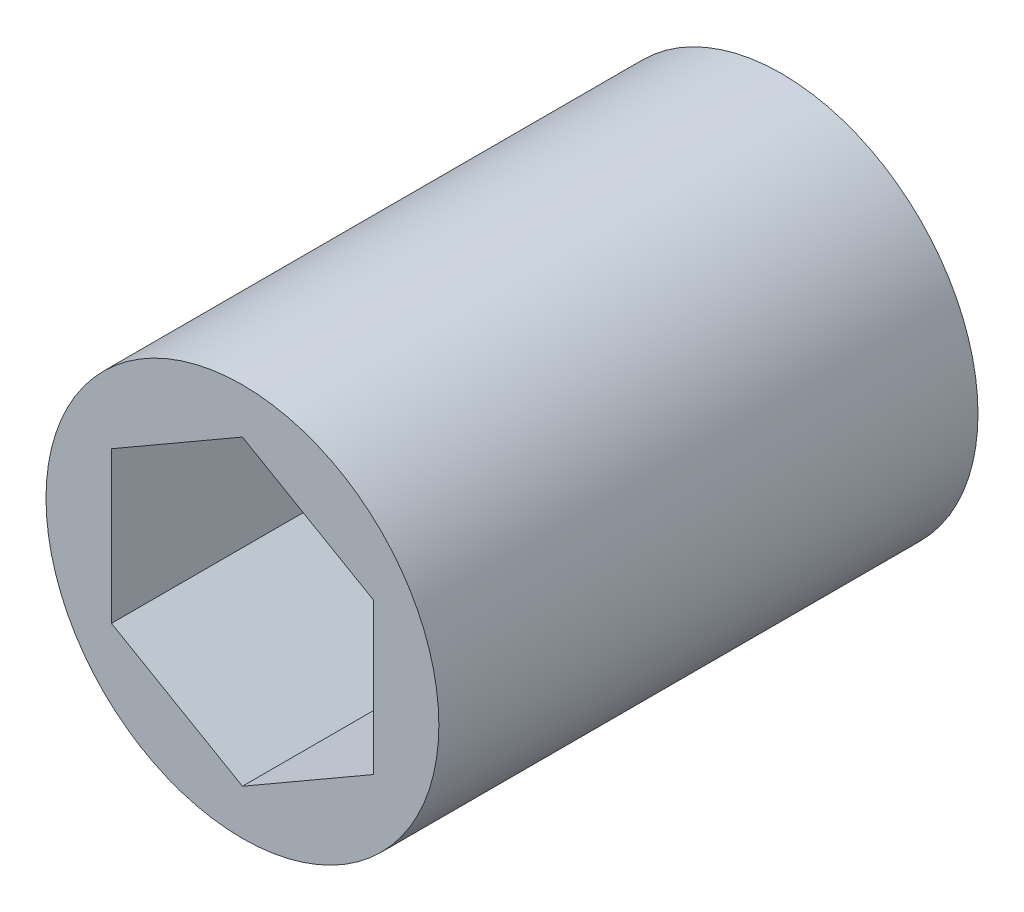
ISO-10303-21;
HEADER;
FILE_DESCRIPTION(('STEP AP214'),'2;1');
FILE_NAME('part.step','',(''),(''),'','','');
FILE_SCHEMA(('AUTOMOTIVE_DESIGN { 1 0 10303 214 1 1 1 1 }'));
ENDSEC;
DATA;
#1=APPLICATION_CONTEXT('core data for automotive mechanical design processes');
#2=APPLICATION_PROTOCOL_DEFINITION('international standard','automotive_design',2000,#1);
#3=PRODUCT_CONTEXT('',#1,'mechanical');
#4=PRODUCT('Part','Part','',(#3));
#5=PRODUCT_RELATED_PRODUCT_CATEGORY('part','',(#4));
#6=PRODUCT_DEFINITION_FORMATION('','',#4);
#7=PRODUCT_DEFINITION_CONTEXT('part definition',#1,'design');
#8=PRODUCT_DEFINITION('design','',#6,#7);
#9=PRODUCT_DEFINITION_SHAPE('','',#8);
#10=(LENGTH_UNIT() NAMED_UNIT(*) SI_UNIT(.MILLI.,.METRE.));
#11=(NAMED_UNIT(*) PLANE_ANGLE_UNIT() SI_UNIT($,.RADIAN.));
#12=(NAMED_UNIT(*) SI_UNIT($,.STERADIAN.) SOLID_ANGLE_UNIT());
#13=UNCERTAINTY_MEASURE_WITH_UNIT(LENGTH_MEASURE(1.E-05),#10,'distance_accuracy_value','');
#14=(GEOMETRIC_REPRESENTATION_CONTEXT(3) GLOBAL_UNCERTAINTY_ASSIGNED_CONTEXT((#13)) GLOBAL_UNIT_ASSIGNED_CONTEXT((#10,
#11,#12)) REPRESENTATION_CONTEXT('',''));
#15=CARTESIAN_POINT('',(0.,0.,0.));
#16=DIRECTION('',(0.,0.,1.));
#17=DIRECTION('',(1.,0.,0.));
#18=AXIS2_PLACEMENT_3D('',#15,#16,#17);
#19=CARTESIAN_POINT('',(0.,0.,13.072237));
#20=DIRECTION('',(0.,0.,1.));
#21=DIRECTION('',(1.,0.,0.));
#22=AXIS2_PLACEMENT_3D('',#19,#20,#21);
#23=PLANE('',#22);
#24=CARTESIAN_POINT('',(0.,0.,13.072237));
#25=DIRECTION('',(0.,0.,1.));
#26=DIRECTION('',(1.,0.,0.));
#27=AXIS2_PLACEMENT_3D('',#24,#25,#26);
#28=CIRCLE('',#27,9.525);
#29=CARTESIAN_POINT('',(9.525,0.,13.072237));
#30=VERTEX_POINT('',#29);
#31=EDGE_CURVE('E11',#30,#30,#28,.T.);
#32=ORIENTED_EDGE('',*,*,#31,.T.);
#33=EDGE_LOOP('',(#32));
#34=FACE_BOUND('',#33,.T.);
#35=DIRECTION('',(-0.866025403784439,-0.5,0.));
#36=VECTOR('',#35,1.);
#37=CARTESIAN_POINT('',(0.,7.33234841870825,13.072237));
#38=LINE('',#37,#36);
#39=CARTESIAN_POINT('',(0.,7.33234841870825,13.072237));
#40=VERTEX_POINT('',#39);
#41=CARTESIAN_POINT('',(-6.35,3.66617420935412,13.072237));
#42=VERTEX_POINT('',#41);
#43=EDGE_CURVE('E106',#40,#42,#38,.T.);
#44=ORIENTED_EDGE('',*,*,#43,.F.);
#45=DIRECTION('',(-0.866025403784439,0.5,0.));
#46=VECTOR('',#45,1.);
#47=CARTESIAN_POINT('',(6.35,3.66617420935413,13.072237));
#48=LINE('',#47,#46);
#49=CARTESIAN_POINT('',(6.35,3.66617420935413,13.072237));
#50=VERTEX_POINT('',#49);
#51=EDGE_CURVE('E97',#50,#40,#48,.T.);
#52=ORIENTED_EDGE('',*,*,#51,.F.);
#53=DIRECTION('',(0.,1.,0.));
#54=VECTOR('',#53,1.);
#55=CARTESIAN_POINT('',(6.35,-3.66617420935412,13.072237));
#56=LINE('',#55,#54);
#57=CARTESIAN_POINT('',(6.35,-3.66617420935412,13.072237));
#58=VERTEX_POINT('',#57);
#59=EDGE_CURVE('E131',#58,#50,#56,.T.);
#60=ORIENTED_EDGE('',*,*,#59,.F.);
#61=DIRECTION('',(0.866025403784438,0.5,0.));
#62=VECTOR('',#61,1.);
#63=CARTESIAN_POINT('',(0.,-7.33234841870825,13.072237));
#64=LINE('',#63,#62);
#65=CARTESIAN_POINT('',(0.,-7.33234841870825,13.072237));
#66=VERTEX_POINT('',#65);
#67=EDGE_CURVE('E128',#66,#58,#64,.T.);
#68=ORIENTED_EDGE('',*,*,#67,.F.);
#69=DIRECTION('',(0.866025403784439,-0.5,0.));
#70=VECTOR('',#69,1.);
#71=CARTESIAN_POINT('',(-6.35,-3.66617420935412,13.072237));
#72=LINE('',#71,#70);
#73=CARTESIAN_POINT('',(-6.35,-3.66617420935412,13.072237));
#74=VERTEX_POINT('',#73);
#75=EDGE_CURVE('E123',#74,#66,#72,.T.);
#76=ORIENTED_EDGE('',*,*,#75,.F.);
#77=DIRECTION('',(0.,-1.,0.));
#78=VECTOR('',#77,1.);
#79=CARTESIAN_POINT('',(-6.35,3.66617420935412,13.072237));
#80=LINE('',#79,#78);
#81=EDGE_CURVE('E119',#42,#74,#80,.T.);
#82=ORIENTED_EDGE('',*,*,#81,.F.);
#83=EDGE_LOOP('',(#44,#52,#60,#68,#76,#82));
#84=FACE_BOUND('',#83,.T.);
#85=ADVANCED_FACE('F43',(#34,#84),#23,.T.);
#86=CARTESIAN_POINT('',(0.,0.,-13.072237));
#87=DIRECTION('',(0.,0.,1.));
#88=DIRECTION('',(1.,0.,0.));
#89=AXIS2_PLACEMENT_3D('',#86,#87,#88);
#90=PLANE('',#89);
#91=CARTESIAN_POINT('',(0.,0.,-13.072237));
#92=DIRECTION('',(0.,0.,1.));
#93=DIRECTION('',(1.,0.,0.));
#94=AXIS2_PLACEMENT_3D('',#91,#92,#93);
#95=CIRCLE('',#94,9.525);
#96=CARTESIAN_POINT('',(9.525,0.,-13.072237));
#97=VERTEX_POINT('',#96);
#98=EDGE_CURVE('E47',#97,#97,#95,.T.);
#99=ORIENTED_EDGE('',*,*,#98,.F.);
#100=EDGE_LOOP('',(#99));
#101=FACE_BOUND('',#100,.T.);
#102=DIRECTION('',(-0.866025403784439,0.5,0.));
#103=VECTOR('',#102,1.);
#104=CARTESIAN_POINT('',(6.35,3.66617420935413,-13.072237));
#105=LINE('',#104,#103);
#106=CARTESIAN_POINT('',(6.35,3.66617420935413,-13.072237));
#107=VERTEX_POINT('',#106);
#108=CARTESIAN_POINT('',(0.,7.33234841870825,-13.072237));
#109=VERTEX_POINT('',#108);
#110=EDGE_CURVE('E67',#107,#109,#105,.T.);
#111=ORIENTED_EDGE('',*,*,#110,.T.);
#112=DIRECTION('',(-0.866025403784439,-0.5,0.));
#113=VECTOR('',#112,1.);
#114=CARTESIAN_POINT('',(0.,7.33234841870825,-13.072237));
#115=LINE('',#114,#113);
#116=CARTESIAN_POINT('',(-6.35,3.66617420935412,-13.072237));
#117=VERTEX_POINT('',#116);
#118=EDGE_CURVE('E113',#109,#117,#115,.T.);
#119=ORIENTED_EDGE('',*,*,#118,.T.);
#120=DIRECTION('',(0.,-1.,0.));
#121=VECTOR('',#120,1.);
#122=CARTESIAN_POINT('',(-6.35,3.66617420935412,-13.072237));
#123=LINE('',#122,#121);
#124=CARTESIAN_POINT('',(-6.35,-3.66617420935412,-13.072237));
#125=VERTEX_POINT('',#124);
#126=EDGE_CURVE('E138',#117,#125,#123,.T.);
#127=ORIENTED_EDGE('',*,*,#126,.T.);
#128=DIRECTION('',(0.866025403784439,-0.5,0.));
#129=VECTOR('',#128,1.);
#130=CARTESIAN_POINT('',(-6.35,-3.66617420935412,-13.072237));
#131=LINE('',#130,#129);
#132=CARTESIAN_POINT('',(0.,-7.33234841870825,-13.072237));
#133=VERTEX_POINT('',#132);
#134=EDGE_CURVE('E142',#125,#133,#131,.T.);
#135=ORIENTED_EDGE('',*,*,#134,.T.);
#136=DIRECTION('',(0.866025403784438,0.5,0.));
#137=VECTOR('',#136,1.);
#138=CARTESIAN_POINT('',(0.,-7.33234841870825,-13.072237));
#139=LINE('',#138,#137);
#140=CARTESIAN_POINT('',(6.35,-3.66617420935412,-13.072237));
#141=VERTEX_POINT('',#140);
#142=EDGE_CURVE('E146',#133,#141,#139,.T.);
#143=ORIENTED_EDGE('',*,*,#142,.T.);
#144=DIRECTION('',(0.,1.,0.));
#145=VECTOR('',#144,1.);
#146=CARTESIAN_POINT('',(6.35,-3.66617420935412,-13.072237));
#147=LINE('',#146,#145);
#148=EDGE_CURVE('E107',#141,#107,#147,.T.);
#149=ORIENTED_EDGE('',*,*,#148,.T.);
#150=EDGE_LOOP('',(#111,#119,#127,#135,#143,#149));
#151=FACE_BOUND('',#150,.T.);
#152=ADVANCED_FACE('F170',(#101,#151),#90,.F.);
#153=CARTESIAN_POINT('',(0.,0.,13.072237));
#154=DIRECTION('',(0.,0.,-1.));
#155=DIRECTION('',(-1.,0.,0.));
#156=AXIS2_PLACEMENT_3D('',#153,#154,#155);
#157=CYLINDRICAL_SURFACE('',#156,9.525);
#158=ORIENTED_EDGE('',*,*,#31,.F.);
#159=EDGE_LOOP('',(#158));
#160=FACE_BOUND('',#159,.T.);
#161=ORIENTED_EDGE('',*,*,#98,.T.);
#162=EDGE_LOOP('',(#161));
#163=FACE_BOUND('',#162,.T.);
#164=ADVANCED_FACE('F45',(#160,#163),#157,.T.);
#165=CARTESIAN_POINT('',(6.35,3.66617420935413,13.072237));
#166=DIRECTION('',(-0.5,-0.866025403784439,0.));
#167=DIRECTION('',(0.866025403784439,-0.5,0.));
#168=AXIS2_PLACEMENT_3D('',#165,#166,#167);
#169=PLANE('',#168);
#170=ORIENTED_EDGE('',*,*,#110,.F.);
#171=DIRECTION('',(0.,0.,-1.));
#172=VECTOR('',#171,1.);
#173=CARTESIAN_POINT('',(6.35,3.66617420935413,13.072237));
#174=LINE('',#173,#172);
#175=EDGE_CURVE('E101',#50,#107,#174,.T.);
#176=ORIENTED_EDGE('',*,*,#175,.F.);
#177=ORIENTED_EDGE('',*,*,#51,.T.);
#178=DIRECTION('',(0.,0.,-1.));
#179=VECTOR('',#178,1.);
#180=CARTESIAN_POINT('',(0.,7.33234841870825,13.072237));
#181=LINE('',#180,#179);
#182=EDGE_CURVE('E100',#40,#109,#181,.T.);
#183=ORIENTED_EDGE('',*,*,#182,.T.);
#184=EDGE_LOOP('',(#170,#176,#177,#183));
#185=FACE_BOUND('',#184,.T.);
#186=ADVANCED_FACE('F99',(#185),#169,.T.);
#187=CARTESIAN_POINT('',(0.,7.33234841870825,13.072237));
#188=DIRECTION('',(0.5,-0.866025403784438,0.));
#189=DIRECTION('',(0.866025403784439,0.5,0.));
#190=AXIS2_PLACEMENT_3D('',#187,#188,#189);
#191=PLANE('',#190);
#192=ORIENTED_EDGE('',*,*,#118,.F.);
#193=ORIENTED_EDGE('',*,*,#182,.F.);
#194=ORIENTED_EDGE('',*,*,#43,.T.);
#195=DIRECTION('',(0.,0.,-1.));
#196=VECTOR('',#195,1.);
#197=CARTESIAN_POINT('',(-6.35,3.66617420935412,13.072237));
#198=LINE('',#197,#196);
#199=EDGE_CURVE('E115',#42,#117,#198,.T.);
#200=ORIENTED_EDGE('',*,*,#199,.T.);
#201=EDGE_LOOP('',(#192,#193,#194,#200));
#202=FACE_BOUND('',#201,.T.);
#203=ADVANCED_FACE('F110',(#202),#191,.T.);
#204=CARTESIAN_POINT('',(-6.35,3.66617420935412,13.072237));
#205=DIRECTION('',(1.,0.,0.));
#206=DIRECTION('',(0.,1.,0.));
#207=AXIS2_PLACEMENT_3D('',#204,#205,#206);
#208=PLANE('',#207);
#209=ORIENTED_EDGE('',*,*,#126,.F.);
#210=ORIENTED_EDGE('',*,*,#199,.F.);
#211=ORIENTED_EDGE('',*,*,#81,.T.);
#212=DIRECTION('',(0.,0.,-1.));
#213=VECTOR('',#212,1.);
#214=CARTESIAN_POINT('',(-6.35,-3.66617420935412,13.072237));
#215=LINE('',#214,#213);
#216=EDGE_CURVE('E160',#74,#125,#215,.T.);
#217=ORIENTED_EDGE('',*,*,#216,.T.);
#218=EDGE_LOOP('',(#209,#210,#211,#217));
#219=FACE_BOUND('',#218,.T.);
#220=ADVANCED_FACE('F166',(#219),#208,.T.);
#221=CARTESIAN_POINT('',(-6.35,-3.66617420935412,13.072237));
#222=DIRECTION('',(0.5,0.866025403784439,0.));
#223=DIRECTION('',(-0.866025403784439,0.5,0.));
#224=AXIS2_PLACEMENT_3D('',#221,#222,#223);
#225=PLANE('',#224);
#226=ORIENTED_EDGE('',*,*,#134,.F.);
#227=ORIENTED_EDGE('',*,*,#216,.F.);
#228=ORIENTED_EDGE('',*,*,#75,.T.);
#229=DIRECTION('',(0.,0.,-1.));
#230=VECTOR('',#229,1.);
#231=CARTESIAN_POINT('',(0.,-7.33234841870825,13.072237));
#232=LINE('',#231,#230);
#233=EDGE_CURVE('E157',#66,#133,#232,.T.);
#234=ORIENTED_EDGE('',*,*,#233,.T.);
#235=EDGE_LOOP('',(#226,#227,#228,#234));
#236=FACE_BOUND('',#235,.T.);
#237=ADVANCED_FACE('F178',(#236),#225,.T.);
#238=CARTESIAN_POINT('',(0.,-7.33234841870825,13.072237));
#239=DIRECTION('',(-0.5,0.866025403784439,0.));
#240=DIRECTION('',(-0.866025403784439,-0.5,0.));
#241=AXIS2_PLACEMENT_3D('',#238,#239,#240);
#242=PLANE('',#241);
#243=ORIENTED_EDGE('',*,*,#142,.F.);
#244=ORIENTED_EDGE('',*,*,#233,.F.);
#245=ORIENTED_EDGE('',*,*,#67,.T.);
#246=DIRECTION('',(0.,0.,-1.));
#247=VECTOR('',#246,1.);
#248=CARTESIAN_POINT('',(6.35,-3.66617420935412,13.072237));
#249=LINE('',#248,#247);
#250=EDGE_CURVE('E59',#58,#141,#249,.T.);
#251=ORIENTED_EDGE('',*,*,#250,.T.);
#252=EDGE_LOOP('',(#243,#244,#245,#251));
#253=FACE_BOUND('',#252,.T.);
#254=ADVANCED_FACE('F176',(#253),#242,.T.);
#255=CARTESIAN_POINT('',(6.35,-3.66617420935412,13.072237));
#256=DIRECTION('',(-1.,0.,0.));
#257=DIRECTION('',(0.,-1.,0.));
#258=AXIS2_PLACEMENT_3D('',#255,#256,#257);
#259=PLANE('',#258);
#260=ORIENTED_EDGE('',*,*,#148,.F.);
#261=ORIENTED_EDGE('',*,*,#250,.F.);
#262=ORIENTED_EDGE('',*,*,#59,.T.);
#263=ORIENTED_EDGE('',*,*,#175,.T.);
#264=EDGE_LOOP('',(#260,#261,#262,#263));
#265=FACE_BOUND('',#264,.T.);
#266=ADVANCED_FACE('F172',(#265),#259,.T.);
#267=CLOSED_SHELL('',(#85,#152,#164,#186,#203,#220,#237,#254,#266));
#268=MANIFOLD_SOLID_BREP('B2',#267);
#269=ADVANCED_BREP_SHAPE_REPRESENTATION('',(#18,#268),#14);
#270=SHAPE_DEFINITION_REPRESENTATION(#9,#269);
ENDSEC;
END-ISO-10303-21;
